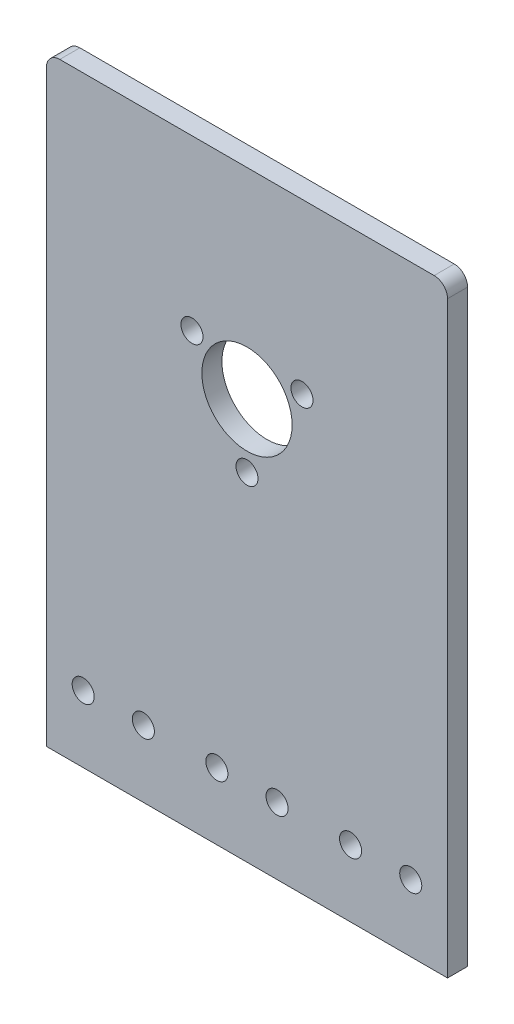
ISO-10303-21;
HEADER;
FILE_DESCRIPTION(('STEP AP214'),'2;1');
FILE_NAME('part.step','',(''),(''),'','','');
FILE_SCHEMA(('AUTOMOTIVE_DESIGN { 1 0 10303 214 1 1 1 1 }'));
ENDSEC;
DATA;
#1=APPLICATION_CONTEXT('core data for automotive mechanical design processes');
#2=APPLICATION_PROTOCOL_DEFINITION('international standard','automotive_design',2000,#1);
#3=PRODUCT_CONTEXT('',#1,'mechanical');
#4=PRODUCT('Part','Part','',(#3));
#5=PRODUCT_RELATED_PRODUCT_CATEGORY('part','',(#4));
#6=PRODUCT_DEFINITION_FORMATION('','',#4);
#7=PRODUCT_DEFINITION_CONTEXT('part definition',#1,'design');
#8=PRODUCT_DEFINITION('design','',#6,#7);
#9=PRODUCT_DEFINITION_SHAPE('','',#8);
#10=(LENGTH_UNIT() NAMED_UNIT(*) SI_UNIT(.MILLI.,.METRE.));
#11=(NAMED_UNIT(*) PLANE_ANGLE_UNIT() SI_UNIT($,.RADIAN.));
#12=(NAMED_UNIT(*) SI_UNIT($,.STERADIAN.) SOLID_ANGLE_UNIT());
#13=UNCERTAINTY_MEASURE_WITH_UNIT(LENGTH_MEASURE(1.E-05),#10,'distance_accuracy_value','');
#14=(GEOMETRIC_REPRESENTATION_CONTEXT(3) GLOBAL_UNCERTAINTY_ASSIGNED_CONTEXT((#13)) GLOBAL_UNIT_ASSIGNED_CONTEXT((#10,
#11,#12)) REPRESENTATION_CONTEXT('',''));
#15=CARTESIAN_POINT('',(0.,0.,0.));
#16=DIRECTION('',(0.,0.,1.));
#17=DIRECTION('',(1.,0.,0.));
#18=AXIS2_PLACEMENT_3D('',#15,#16,#17);
#19=CARTESIAN_POINT('',(30.,-45.,3.));
#20=DIRECTION('',(-1.,0.,0.));
#21=DIRECTION('',(0.,0.,1.));
#22=AXIS2_PLACEMENT_3D('',#19,#20,#21);
#23=PLANE('',#22);
#24=DIRECTION('',(0.,1.,0.));
#25=VECTOR('',#24,1.);
#26=CARTESIAN_POINT('',(30.,-45.,0.));
#27=LINE('',#26,#25);
#28=CARTESIAN_POINT('',(30.,-45.,0.));
#29=VERTEX_POINT('',#28);
#30=CARTESIAN_POINT('',(30.,43.,0.));
#31=VERTEX_POINT('',#30);
#32=EDGE_CURVE('E128',#29,#31,#27,.T.);
#33=ORIENTED_EDGE('',*,*,#32,.T.);
#34=DIRECTION('',(0.,0.,-1.));
#35=VECTOR('',#34,1.);
#36=CARTESIAN_POINT('',(30.,43.,3.));
#37=LINE('',#36,#35);
#38=CARTESIAN_POINT('',(30.,43.,3.));
#39=VERTEX_POINT('',#38);
#40=EDGE_CURVE('E66',#31,#39,#37,.F.);
#41=ORIENTED_EDGE('',*,*,#40,.T.);
#42=DIRECTION('',(0.,1.,0.));
#43=VECTOR('',#42,1.);
#44=CARTESIAN_POINT('',(30.,-45.,3.));
#45=LINE('',#44,#43);
#46=CARTESIAN_POINT('',(30.,-45.,3.));
#47=VERTEX_POINT('',#46);
#48=EDGE_CURVE('E142',#47,#39,#45,.T.);
#49=ORIENTED_EDGE('',*,*,#48,.F.);
#50=DIRECTION('',(0.,0.,-1.));
#51=VECTOR('',#50,1.);
#52=CARTESIAN_POINT('',(30.,-45.,3.));
#53=LINE('',#52,#51);
#54=EDGE_CURVE('E118',#47,#29,#53,.T.);
#55=ORIENTED_EDGE('',*,*,#54,.T.);
#56=EDGE_LOOP('',(#33,#41,#49,#55));
#57=FACE_BOUND('',#56,.T.);
#58=ADVANCED_FACE('F44',(#57),#23,.F.);
#59=CARTESIAN_POINT('',(-30.,45.,3.));
#60=DIRECTION('',(0.,-1.,0.));
#61=DIRECTION('',(0.,0.,-1.));
#62=AXIS2_PLACEMENT_3D('',#59,#60,#61);
#63=PLANE('',#62);
#64=DIRECTION('',(-1.,0.,0.));
#65=VECTOR('',#64,1.);
#66=CARTESIAN_POINT('',(-30.,45.,3.));
#67=LINE('',#66,#65);
#68=CARTESIAN_POINT('',(28.,45.,3.));
#69=VERTEX_POINT('',#68);
#70=CARTESIAN_POINT('',(-28.,45.,3.));
#71=VERTEX_POINT('',#70);
#72=EDGE_CURVE('E108',#69,#71,#67,.T.);
#73=ORIENTED_EDGE('',*,*,#72,.F.);
#74=DIRECTION('',(0.,0.,-1.));
#75=VECTOR('',#74,1.);
#76=CARTESIAN_POINT('',(28.,45.,3.));
#77=LINE('',#76,#75);
#78=CARTESIAN_POINT('',(28.,45.,0.));
#79=VERTEX_POINT('',#78);
#80=EDGE_CURVE('E143',#69,#79,#77,.T.);
#81=ORIENTED_EDGE('',*,*,#80,.T.);
#82=DIRECTION('',(-1.,0.,0.));
#83=VECTOR('',#82,1.);
#84=CARTESIAN_POINT('',(-30.,45.,0.));
#85=LINE('',#84,#83);
#86=CARTESIAN_POINT('',(-28.,45.,0.));
#87=VERTEX_POINT('',#86);
#88=EDGE_CURVE('E135',#79,#87,#85,.T.);
#89=ORIENTED_EDGE('',*,*,#88,.T.);
#90=DIRECTION('',(0.,0.,-1.));
#91=VECTOR('',#90,1.);
#92=CARTESIAN_POINT('',(-28.,45.,3.));
#93=LINE('',#92,#91);
#94=EDGE_CURVE('E117',#87,#71,#93,.F.);
#95=ORIENTED_EDGE('',*,*,#94,.T.);
#96=EDGE_LOOP('',(#73,#81,#89,#95));
#97=FACE_BOUND('',#96,.T.);
#98=ADVANCED_FACE('F165',(#97),#63,.F.);
#99=CARTESIAN_POINT('',(-30.,-45.,3.));
#100=DIRECTION('',(1.,0.,0.));
#101=DIRECTION('',(0.,0.,-1.));
#102=AXIS2_PLACEMENT_3D('',#99,#100,#101);
#103=PLANE('',#102);
#104=DIRECTION('',(0.,-1.,0.));
#105=VECTOR('',#104,1.);
#106=CARTESIAN_POINT('',(-30.,-45.,3.));
#107=LINE('',#106,#105);
#108=CARTESIAN_POINT('',(-30.,43.,3.));
#109=VERTEX_POINT('',#108);
#110=CARTESIAN_POINT('',(-30.,-45.,3.));
#111=VERTEX_POINT('',#110);
#112=EDGE_CURVE('E100',#109,#111,#107,.T.);
#113=ORIENTED_EDGE('',*,*,#112,.F.);
#114=DIRECTION('',(0.,0.,-1.));
#115=VECTOR('',#114,1.);
#116=CARTESIAN_POINT('',(-30.,43.,3.));
#117=LINE('',#116,#115);
#118=CARTESIAN_POINT('',(-30.,43.,0.));
#119=VERTEX_POINT('',#118);
#120=EDGE_CURVE('E11',#109,#119,#117,.T.);
#121=ORIENTED_EDGE('',*,*,#120,.T.);
#122=DIRECTION('',(0.,-1.,0.));
#123=VECTOR('',#122,1.);
#124=CARTESIAN_POINT('',(-30.,-45.,0.));
#125=LINE('',#124,#123);
#126=CARTESIAN_POINT('',(-30.,-45.,0.));
#127=VERTEX_POINT('',#126);
#128=EDGE_CURVE('E112',#119,#127,#125,.T.);
#129=ORIENTED_EDGE('',*,*,#128,.T.);
#130=DIRECTION('',(0.,0.,-1.));
#131=VECTOR('',#130,1.);
#132=CARTESIAN_POINT('',(-30.,-45.,3.));
#133=LINE('',#132,#131);
#134=EDGE_CURVE('E111',#111,#127,#133,.T.);
#135=ORIENTED_EDGE('',*,*,#134,.F.);
#136=EDGE_LOOP('',(#113,#121,#129,#135));
#137=FACE_BOUND('',#136,.T.);
#138=ADVANCED_FACE('F115',(#137),#103,.F.);
#139=CARTESIAN_POINT('',(-30.,-45.,3.));
#140=DIRECTION('',(0.,1.,0.));
#141=DIRECTION('',(0.,0.,1.));
#142=AXIS2_PLACEMENT_3D('',#139,#140,#141);
#143=PLANE('',#142);
#144=DIRECTION('',(1.,0.,0.));
#145=VECTOR('',#144,1.);
#146=CARTESIAN_POINT('',(-30.,-45.,0.));
#147=LINE('',#146,#145);
#148=EDGE_CURVE('E139',#127,#29,#147,.T.);
#149=ORIENTED_EDGE('',*,*,#148,.T.);
#150=ORIENTED_EDGE('',*,*,#54,.F.);
#151=DIRECTION('',(1.,0.,0.));
#152=VECTOR('',#151,1.);
#153=CARTESIAN_POINT('',(-30.,-45.,3.));
#154=LINE('',#153,#152);
#155=EDGE_CURVE('E101',#111,#47,#154,.T.);
#156=ORIENTED_EDGE('',*,*,#155,.F.);
#157=ORIENTED_EDGE('',*,*,#134,.T.);
#158=EDGE_LOOP('',(#149,#150,#156,#157));
#159=FACE_BOUND('',#158,.T.);
#160=ADVANCED_FACE('F122',(#159),#143,.F.);
#161=CARTESIAN_POINT('',(0.,0.,3.));
#162=DIRECTION('',(0.,0.,-1.));
#163=DIRECTION('',(-1.,0.,0.));
#164=AXIS2_PLACEMENT_3D('',#161,#162,#163);
#165=PLANE('',#164);
#166=CARTESIAN_POINT('',(0.,15.,3.));
#167=DIRECTION('',(0.,0.,1.));
#168=DIRECTION('',(1.,0.,0.));
#169=AXIS2_PLACEMENT_3D('',#166,#167,#168);
#170=CIRCLE('',#169,6.75);
#171=CARTESIAN_POINT('',(6.75000000000001,15.,3.));
#172=VERTEX_POINT('',#171);
#173=EDGE_CURVE('E250',#172,#172,#170,.T.);
#174=ORIENTED_EDGE('',*,*,#173,.F.);
#175=EDGE_LOOP('',(#174));
#176=FACE_BOUND('',#175,.T.);
#177=CARTESIAN_POINT('',(-24.5,-35.,3.));
#178=DIRECTION('',(0.,0.,1.));
#179=DIRECTION('',(1.,0.,0.));
#180=AXIS2_PLACEMENT_3D('',#177,#178,#179);
#181=CIRCLE('',#180,1.65);
#182=CARTESIAN_POINT('',(-22.85,-35.,3.));
#183=VERTEX_POINT('',#182);
#184=EDGE_CURVE('E227',#183,#183,#181,.T.);
#185=ORIENTED_EDGE('',*,*,#184,.F.);
#186=EDGE_LOOP('',(#185));
#187=FACE_BOUND('',#186,.T.);
#188=CARTESIAN_POINT('',(15.5,-35.,3.));
#189=DIRECTION('',(0.,0.,1.));
#190=DIRECTION('',(1.,0.,0.));
#191=AXIS2_PLACEMENT_3D('',#188,#189,#190);
#192=CIRCLE('',#191,1.65);
#193=CARTESIAN_POINT('',(17.15,-35.,3.));
#194=VERTEX_POINT('',#193);
#195=EDGE_CURVE('E211',#194,#194,#192,.T.);
#196=ORIENTED_EDGE('',*,*,#195,.F.);
#197=EDGE_LOOP('',(#196));
#198=FACE_BOUND('',#197,.T.);
#199=CARTESIAN_POINT('',(24.5,-35.,3.));
#200=DIRECTION('',(0.,0.,1.));
#201=DIRECTION('',(1.,0.,0.));
#202=AXIS2_PLACEMENT_3D('',#199,#200,#201);
#203=CIRCLE('',#202,1.65);
#204=CARTESIAN_POINT('',(26.15,-35.,3.));
#205=VERTEX_POINT('',#204);
#206=EDGE_CURVE('E214',#205,#205,#203,.T.);
#207=ORIENTED_EDGE('',*,*,#206,.F.);
#208=EDGE_LOOP('',(#207));
#209=FACE_BOUND('',#208,.T.);
#210=CARTESIAN_POINT('',(-4.49999999999999,-35.,3.));
#211=DIRECTION('',(0.,0.,1.));
#212=DIRECTION('',(1.,0.,0.));
#213=AXIS2_PLACEMENT_3D('',#210,#211,#212);
#214=CIRCLE('',#213,1.65);
#215=CARTESIAN_POINT('',(-2.84999999999999,-35.,3.));
#216=VERTEX_POINT('',#215);
#217=EDGE_CURVE('E203',#216,#216,#214,.T.);
#218=ORIENTED_EDGE('',*,*,#217,.F.);
#219=EDGE_LOOP('',(#218));
#220=FACE_BOUND('',#219,.T.);
#221=CARTESIAN_POINT('',(-15.5,-35.,3.));
#222=DIRECTION('',(0.,0.,1.));
#223=DIRECTION('',(1.,0.,0.));
#224=AXIS2_PLACEMENT_3D('',#221,#222,#223);
#225=CIRCLE('',#224,1.65);
#226=CARTESIAN_POINT('',(-13.85,-35.,3.));
#227=VERTEX_POINT('',#226);
#228=EDGE_CURVE('E226',#227,#227,#225,.T.);
#229=ORIENTED_EDGE('',*,*,#228,.F.);
#230=EDGE_LOOP('',(#229));
#231=FACE_BOUND('',#230,.T.);
#232=CARTESIAN_POINT('',(4.50000000000001,-35.,3.));
#233=DIRECTION('',(0.,0.,1.));
#234=DIRECTION('',(1.,0.,0.));
#235=AXIS2_PLACEMENT_3D('',#232,#233,#234);
#236=CIRCLE('',#235,1.65);
#237=CARTESIAN_POINT('',(6.15000000000001,-35.,3.));
#238=VERTEX_POINT('',#237);
#239=EDGE_CURVE('E196',#238,#238,#236,.T.);
#240=ORIENTED_EDGE('',*,*,#239,.F.);
#241=EDGE_LOOP('',(#240));
#242=FACE_BOUND('',#241,.T.);
#243=CARTESIAN_POINT('',(0.,5.5,3.));
#244=DIRECTION('',(0.,0.,1.));
#245=DIRECTION('',(1.,0.,0.));
#246=AXIS2_PLACEMENT_3D('',#243,#244,#245);
#247=CIRCLE('',#246,1.65);
#248=CARTESIAN_POINT('',(1.65000000000001,5.5,3.));
#249=VERTEX_POINT('',#248);
#250=EDGE_CURVE('E191',#249,#249,#247,.T.);
#251=ORIENTED_EDGE('',*,*,#250,.F.);
#252=EDGE_LOOP('',(#251));
#253=FACE_BOUND('',#252,.T.);
#254=CARTESIAN_POINT('',(-8.22724133595216,19.75,3.));
#255=DIRECTION('',(0.,0.,1.));
#256=DIRECTION('',(1.,0.,0.));
#257=AXIS2_PLACEMENT_3D('',#254,#255,#256);
#258=CIRCLE('',#257,1.65);
#259=CARTESIAN_POINT('',(-6.57724133595216,19.75,3.));
#260=VERTEX_POINT('',#259);
#261=EDGE_CURVE('E189',#260,#260,#258,.T.);
#262=ORIENTED_EDGE('',*,*,#261,.F.);
#263=EDGE_LOOP('',(#262));
#264=FACE_BOUND('',#263,.T.);
#265=CARTESIAN_POINT('',(8.22724133595218,19.75,3.));
#266=DIRECTION('',(0.,0.,1.));
#267=DIRECTION('',(1.,0.,0.));
#268=AXIS2_PLACEMENT_3D('',#265,#266,#267);
#269=CIRCLE('',#268,1.65);
#270=CARTESIAN_POINT('',(9.87724133595218,19.75,3.));
#271=VERTEX_POINT('',#270);
#272=EDGE_CURVE('E177',#271,#271,#269,.T.);
#273=ORIENTED_EDGE('',*,*,#272,.F.);
#274=EDGE_LOOP('',(#273));
#275=FACE_BOUND('',#274,.T.);
#276=ORIENTED_EDGE('',*,*,#48,.T.);
#277=CARTESIAN_POINT('',(28.,43.,3.));
#278=DIRECTION('',(0.,0.,-1.));
#279=DIRECTION('',(-1.,0.,0.));
#280=AXIS2_PLACEMENT_3D('',#277,#278,#279);
#281=CIRCLE('',#280,2.);
#282=EDGE_CURVE('E53',#39,#69,#281,.F.);
#283=ORIENTED_EDGE('',*,*,#282,.T.);
#284=ORIENTED_EDGE('',*,*,#72,.T.);
#285=CARTESIAN_POINT('',(-28.,43.,3.));
#286=DIRECTION('',(0.,0.,-1.));
#287=DIRECTION('',(-1.,0.,0.));
#288=AXIS2_PLACEMENT_3D('',#285,#286,#287);
#289=CIRCLE('',#288,2.);
#290=EDGE_CURVE('E64',#71,#109,#289,.F.);
#291=ORIENTED_EDGE('',*,*,#290,.T.);
#292=ORIENTED_EDGE('',*,*,#112,.T.);
#293=ORIENTED_EDGE('',*,*,#155,.T.);
#294=EDGE_LOOP('',(#276,#283,#284,#291,#292,#293));
#295=FACE_BOUND('',#294,.T.);
#296=ADVANCED_FACE('F103',(#176,#187,#198,#209,#220,#231,#242,#253,#264,#275,#295),#165,.F.);
#297=CARTESIAN_POINT('',(0.,0.,0.));
#298=DIRECTION('',(0.,0.,-1.));
#299=DIRECTION('',(-1.,0.,0.));
#300=AXIS2_PLACEMENT_3D('',#297,#298,#299);
#301=PLANE('',#300);
#302=CARTESIAN_POINT('',(0.,15.,0.));
#303=DIRECTION('',(0.,0.,1.));
#304=DIRECTION('',(1.,0.,0.));
#305=AXIS2_PLACEMENT_3D('',#302,#303,#304);
#306=CIRCLE('',#305,6.75);
#307=CARTESIAN_POINT('',(6.75000000000001,15.,0.));
#308=VERTEX_POINT('',#307);
#309=EDGE_CURVE('E243',#308,#308,#306,.T.);
#310=ORIENTED_EDGE('',*,*,#309,.T.);
#311=EDGE_LOOP('',(#310));
#312=FACE_BOUND('',#311,.T.);
#313=CARTESIAN_POINT('',(-24.5,-35.,0.));
#314=DIRECTION('',(0.,0.,1.));
#315=DIRECTION('',(1.,0.,0.));
#316=AXIS2_PLACEMENT_3D('',#313,#314,#315);
#317=CIRCLE('',#316,1.65);
#318=CARTESIAN_POINT('',(-22.85,-35.,0.));
#319=VERTEX_POINT('',#318);
#320=EDGE_CURVE('E223',#319,#319,#317,.T.);
#321=ORIENTED_EDGE('',*,*,#320,.T.);
#322=EDGE_LOOP('',(#321));
#323=FACE_BOUND('',#322,.T.);
#324=CARTESIAN_POINT('',(15.5,-35.,0.));
#325=DIRECTION('',(0.,0.,1.));
#326=DIRECTION('',(1.,0.,0.));
#327=AXIS2_PLACEMENT_3D('',#324,#325,#326);
#328=CIRCLE('',#327,1.65);
#329=CARTESIAN_POINT('',(17.15,-35.,0.));
#330=VERTEX_POINT('',#329);
#331=EDGE_CURVE('E235',#330,#330,#328,.T.);
#332=ORIENTED_EDGE('',*,*,#331,.T.);
#333=EDGE_LOOP('',(#332));
#334=FACE_BOUND('',#333,.T.);
#335=CARTESIAN_POINT('',(24.5,-35.,0.));
#336=DIRECTION('',(0.,0.,1.));
#337=DIRECTION('',(1.,0.,0.));
#338=AXIS2_PLACEMENT_3D('',#335,#336,#337);
#339=CIRCLE('',#338,1.65);
#340=CARTESIAN_POINT('',(26.15,-35.,0.));
#341=VERTEX_POINT('',#340);
#342=EDGE_CURVE('E210',#341,#341,#339,.T.);
#343=ORIENTED_EDGE('',*,*,#342,.T.);
#344=EDGE_LOOP('',(#343));
#345=FACE_BOUND('',#344,.T.);
#346=CARTESIAN_POINT('',(-4.49999999999999,-35.,0.));
#347=DIRECTION('',(0.,0.,1.));
#348=DIRECTION('',(1.,0.,0.));
#349=AXIS2_PLACEMENT_3D('',#346,#347,#348);
#350=CIRCLE('',#349,1.65);
#351=CARTESIAN_POINT('',(-2.84999999999999,-35.,0.));
#352=VERTEX_POINT('',#351);
#353=EDGE_CURVE('E217',#352,#352,#350,.T.);
#354=ORIENTED_EDGE('',*,*,#353,.T.);
#355=EDGE_LOOP('',(#354));
#356=FACE_BOUND('',#355,.T.);
#357=CARTESIAN_POINT('',(-15.5,-35.,0.));
#358=DIRECTION('',(0.,0.,1.));
#359=DIRECTION('',(1.,0.,0.));
#360=AXIS2_PLACEMENT_3D('',#357,#358,#359);
#361=CIRCLE('',#360,1.65);
#362=CARTESIAN_POINT('',(-13.85,-35.,0.));
#363=VERTEX_POINT('',#362);
#364=EDGE_CURVE('E237',#363,#363,#361,.T.);
#365=ORIENTED_EDGE('',*,*,#364,.T.);
#366=EDGE_LOOP('',(#365));
#367=FACE_BOUND('',#366,.T.);
#368=CARTESIAN_POINT('',(4.50000000000001,-35.,0.));
#369=DIRECTION('',(0.,0.,1.));
#370=DIRECTION('',(1.,0.,0.));
#371=AXIS2_PLACEMENT_3D('',#368,#369,#370);
#372=CIRCLE('',#371,1.65);
#373=CARTESIAN_POINT('',(6.15000000000001,-35.,0.));
#374=VERTEX_POINT('',#373);
#375=EDGE_CURVE('E179',#374,#374,#372,.T.);
#376=ORIENTED_EDGE('',*,*,#375,.T.);
#377=EDGE_LOOP('',(#376));
#378=FACE_BOUND('',#377,.T.);
#379=CARTESIAN_POINT('',(0.,5.5,0.));
#380=DIRECTION('',(0.,0.,1.));
#381=DIRECTION('',(1.,0.,0.));
#382=AXIS2_PLACEMENT_3D('',#379,#380,#381);
#383=CIRCLE('',#382,1.65);
#384=CARTESIAN_POINT('',(1.65000000000001,5.5,0.));
#385=VERTEX_POINT('',#384);
#386=EDGE_CURVE('E134',#385,#385,#383,.T.);
#387=ORIENTED_EDGE('',*,*,#386,.T.);
#388=EDGE_LOOP('',(#387));
#389=FACE_BOUND('',#388,.T.);
#390=CARTESIAN_POINT('',(-8.22724133595216,19.75,0.));
#391=DIRECTION('',(0.,0.,1.));
#392=DIRECTION('',(1.,0.,0.));
#393=AXIS2_PLACEMENT_3D('',#390,#391,#392);
#394=CIRCLE('',#393,1.65);
#395=CARTESIAN_POINT('',(-6.57724133595216,19.75,0.));
#396=VERTEX_POINT('',#395);
#397=EDGE_CURVE('E183',#396,#396,#394,.T.);
#398=ORIENTED_EDGE('',*,*,#397,.T.);
#399=EDGE_LOOP('',(#398));
#400=FACE_BOUND('',#399,.T.);
#401=CARTESIAN_POINT('',(8.22724133595218,19.75,0.));
#402=DIRECTION('',(0.,0.,1.));
#403=DIRECTION('',(1.,0.,0.));
#404=AXIS2_PLACEMENT_3D('',#401,#402,#403);
#405=CIRCLE('',#404,1.65);
#406=CARTESIAN_POINT('',(9.87724133595218,19.75,0.));
#407=VERTEX_POINT('',#406);
#408=EDGE_CURVE('E174',#407,#407,#405,.T.);
#409=ORIENTED_EDGE('',*,*,#408,.T.);
#410=EDGE_LOOP('',(#409));
#411=FACE_BOUND('',#410,.T.);
#412=ORIENTED_EDGE('',*,*,#88,.F.);
#413=CARTESIAN_POINT('',(28.,43.,0.));
#414=DIRECTION('',(0.,0.,-1.));
#415=DIRECTION('',(-1.,0.,0.));
#416=AXIS2_PLACEMENT_3D('',#413,#414,#415);
#417=CIRCLE('',#416,2.);
#418=EDGE_CURVE('E155',#79,#31,#417,.T.);
#419=ORIENTED_EDGE('',*,*,#418,.T.);
#420=ORIENTED_EDGE('',*,*,#32,.F.);
#421=ORIENTED_EDGE('',*,*,#148,.F.);
#422=ORIENTED_EDGE('',*,*,#128,.F.);
#423=CARTESIAN_POINT('',(-28.,43.,0.));
#424=DIRECTION('',(0.,0.,-1.));
#425=DIRECTION('',(-1.,0.,0.));
#426=AXIS2_PLACEMENT_3D('',#423,#424,#425);
#427=CIRCLE('',#426,2.);
#428=EDGE_CURVE('E148',#119,#87,#427,.T.);
#429=ORIENTED_EDGE('',*,*,#428,.T.);
#430=EDGE_LOOP('',(#412,#419,#420,#421,#422,#429));
#431=FACE_BOUND('',#430,.T.);
#432=ADVANCED_FACE('F171',(#312,#323,#334,#345,#356,#367,#378,#389,#400,#411,#431),#301,.T.);
#433=CARTESIAN_POINT('',(8.22724133595218,19.75,0.));
#434=DIRECTION('',(0.,0.,1.));
#435=DIRECTION('',(1.,0.,0.));
#436=AXIS2_PLACEMENT_3D('',#433,#434,#435);
#437=CYLINDRICAL_SURFACE('',#436,1.65);
#438=ORIENTED_EDGE('',*,*,#408,.F.);
#439=EDGE_LOOP('',(#438));
#440=FACE_BOUND('',#439,.T.);
#441=ORIENTED_EDGE('',*,*,#272,.T.);
#442=EDGE_LOOP('',(#441));
#443=FACE_BOUND('',#442,.T.);
#444=ADVANCED_FACE('F283',(#440,#443),#437,.F.);
#445=CARTESIAN_POINT('',(-8.22724133595216,19.75,0.));
#446=DIRECTION('',(0.,0.,1.));
#447=DIRECTION('',(1.,0.,0.));
#448=AXIS2_PLACEMENT_3D('',#445,#446,#447);
#449=CYLINDRICAL_SURFACE('',#448,1.65);
#450=ORIENTED_EDGE('',*,*,#397,.F.);
#451=EDGE_LOOP('',(#450));
#452=FACE_BOUND('',#451,.T.);
#453=ORIENTED_EDGE('',*,*,#261,.T.);
#454=EDGE_LOOP('',(#453));
#455=FACE_BOUND('',#454,.T.);
#456=ADVANCED_FACE('F290',(#452,#455),#449,.F.);
#457=CARTESIAN_POINT('',(0.,5.5,0.));
#458=DIRECTION('',(0.,0.,1.));
#459=DIRECTION('',(1.,0.,0.));
#460=AXIS2_PLACEMENT_3D('',#457,#458,#459);
#461=CYLINDRICAL_SURFACE('',#460,1.65);
#462=ORIENTED_EDGE('',*,*,#386,.F.);
#463=EDGE_LOOP('',(#462));
#464=FACE_BOUND('',#463,.T.);
#465=ORIENTED_EDGE('',*,*,#250,.T.);
#466=EDGE_LOOP('',(#465));
#467=FACE_BOUND('',#466,.T.);
#468=ADVANCED_FACE('F295',(#464,#467),#461,.F.);
#469=CARTESIAN_POINT('',(4.50000000000001,-35.,0.));
#470=DIRECTION('',(0.,0.,1.));
#471=DIRECTION('',(1.,0.,0.));
#472=AXIS2_PLACEMENT_3D('',#469,#470,#471);
#473=CYLINDRICAL_SURFACE('',#472,1.65);
#474=ORIENTED_EDGE('',*,*,#375,.F.);
#475=EDGE_LOOP('',(#474));
#476=FACE_BOUND('',#475,.T.);
#477=ORIENTED_EDGE('',*,*,#239,.T.);
#478=EDGE_LOOP('',(#477));
#479=FACE_BOUND('',#478,.T.);
#480=ADVANCED_FACE('F372',(#476,#479),#473,.F.);
#481=CARTESIAN_POINT('',(-15.5,-35.,0.));
#482=DIRECTION('',(0.,0.,1.));
#483=DIRECTION('',(1.,0.,0.));
#484=AXIS2_PLACEMENT_3D('',#481,#482,#483);
#485=CYLINDRICAL_SURFACE('',#484,1.65);
#486=ORIENTED_EDGE('',*,*,#364,.F.);
#487=EDGE_LOOP('',(#486));
#488=FACE_BOUND('',#487,.T.);
#489=ORIENTED_EDGE('',*,*,#228,.T.);
#490=EDGE_LOOP('',(#489));
#491=FACE_BOUND('',#490,.T.);
#492=ADVANCED_FACE('F364',(#488,#491),#485,.F.);
#493=CARTESIAN_POINT('',(-4.49999999999999,-35.,0.));
#494=DIRECTION('',(0.,0.,1.));
#495=DIRECTION('',(1.,0.,0.));
#496=AXIS2_PLACEMENT_3D('',#493,#494,#495);
#497=CYLINDRICAL_SURFACE('',#496,1.65);
#498=ORIENTED_EDGE('',*,*,#353,.F.);
#499=EDGE_LOOP('',(#498));
#500=FACE_BOUND('',#499,.T.);
#501=ORIENTED_EDGE('',*,*,#217,.T.);
#502=EDGE_LOOP('',(#501));
#503=FACE_BOUND('',#502,.T.);
#504=ADVANCED_FACE('F354',(#500,#503),#497,.F.);
#505=CARTESIAN_POINT('',(24.5,-35.,0.));
#506=DIRECTION('',(0.,0.,1.));
#507=DIRECTION('',(1.,0.,0.));
#508=AXIS2_PLACEMENT_3D('',#505,#506,#507);
#509=CYLINDRICAL_SURFACE('',#508,1.65);
#510=ORIENTED_EDGE('',*,*,#342,.F.);
#511=EDGE_LOOP('',(#510));
#512=FACE_BOUND('',#511,.T.);
#513=ORIENTED_EDGE('',*,*,#206,.T.);
#514=EDGE_LOOP('',(#513));
#515=FACE_BOUND('',#514,.T.);
#516=ADVANCED_FACE('F343',(#512,#515),#509,.F.);
#517=CARTESIAN_POINT('',(15.5,-35.,0.));
#518=DIRECTION('',(0.,0.,1.));
#519=DIRECTION('',(1.,0.,0.));
#520=AXIS2_PLACEMENT_3D('',#517,#518,#519);
#521=CYLINDRICAL_SURFACE('',#520,1.65);
#522=ORIENTED_EDGE('',*,*,#331,.F.);
#523=EDGE_LOOP('',(#522));
#524=FACE_BOUND('',#523,.T.);
#525=ORIENTED_EDGE('',*,*,#195,.T.);
#526=EDGE_LOOP('',(#525));
#527=FACE_BOUND('',#526,.T.);
#528=ADVANCED_FACE('F334',(#524,#527),#521,.F.);
#529=CARTESIAN_POINT('',(-24.5,-35.,0.));
#530=DIRECTION('',(0.,0.,1.));
#531=DIRECTION('',(1.,0.,0.));
#532=AXIS2_PLACEMENT_3D('',#529,#530,#531);
#533=CYLINDRICAL_SURFACE('',#532,1.65);
#534=ORIENTED_EDGE('',*,*,#320,.F.);
#535=EDGE_LOOP('',(#534));
#536=FACE_BOUND('',#535,.T.);
#537=ORIENTED_EDGE('',*,*,#184,.T.);
#538=EDGE_LOOP('',(#537));
#539=FACE_BOUND('',#538,.T.);
#540=ADVANCED_FACE('F257',(#536,#539),#533,.F.);
#541=CARTESIAN_POINT('',(0.,15.,0.));
#542=DIRECTION('',(0.,0.,1.));
#543=DIRECTION('',(1.,0.,0.));
#544=AXIS2_PLACEMENT_3D('',#541,#542,#543);
#545=CYLINDRICAL_SURFACE('',#544,6.75);
#546=ORIENTED_EDGE('',*,*,#309,.F.);
#547=EDGE_LOOP('',(#546));
#548=FACE_BOUND('',#547,.T.);
#549=ORIENTED_EDGE('',*,*,#173,.T.);
#550=EDGE_LOOP('',(#549));
#551=FACE_BOUND('',#550,.T.);
#552=ADVANCED_FACE('F256',(#548,#551),#545,.F.);
#553=CARTESIAN_POINT('',(28.,43.,3.));
#554=DIRECTION('',(0.,0.,-1.));
#555=DIRECTION('',(-1.,0.,0.));
#556=AXIS2_PLACEMENT_3D('',#553,#554,#555);
#557=CYLINDRICAL_SURFACE('',#556,2.);
#558=ORIENTED_EDGE('',*,*,#282,.F.);
#559=ORIENTED_EDGE('',*,*,#40,.F.);
#560=ORIENTED_EDGE('',*,*,#418,.F.);
#561=ORIENTED_EDGE('',*,*,#80,.F.);
#562=EDGE_LOOP('',(#558,#559,#560,#561));
#563=FACE_BOUND('',#562,.T.);
#564=ADVANCED_FACE('F166',(#563),#557,.T.);
#565=CARTESIAN_POINT('',(-28.,43.,3.));
#566=DIRECTION('',(0.,0.,-1.));
#567=DIRECTION('',(-1.,0.,0.));
#568=AXIS2_PLACEMENT_3D('',#565,#566,#567);
#569=CYLINDRICAL_SURFACE('',#568,2.);
#570=ORIENTED_EDGE('',*,*,#290,.F.);
#571=ORIENTED_EDGE('',*,*,#94,.F.);
#572=ORIENTED_EDGE('',*,*,#428,.F.);
#573=ORIENTED_EDGE('',*,*,#120,.F.);
#574=EDGE_LOOP('',(#570,#571,#572,#573));
#575=FACE_BOUND('',#574,.T.);
#576=ADVANCED_FACE('F50',(#575),#569,.T.);
#577=CLOSED_SHELL('',(#58,#98,#138,#160,#296,#432,#444,#456,#468,#480,#492,#504,#516,#528,#540,
#552,#564,#576));
#578=MANIFOLD_SOLID_BREP('B2',#577);
#579=ADVANCED_BREP_SHAPE_REPRESENTATION('',(#18,#578),#14);
#580=SHAPE_DEFINITION_REPRESENTATION(#9,#579);
ENDSEC;
END-ISO-10303-21;
